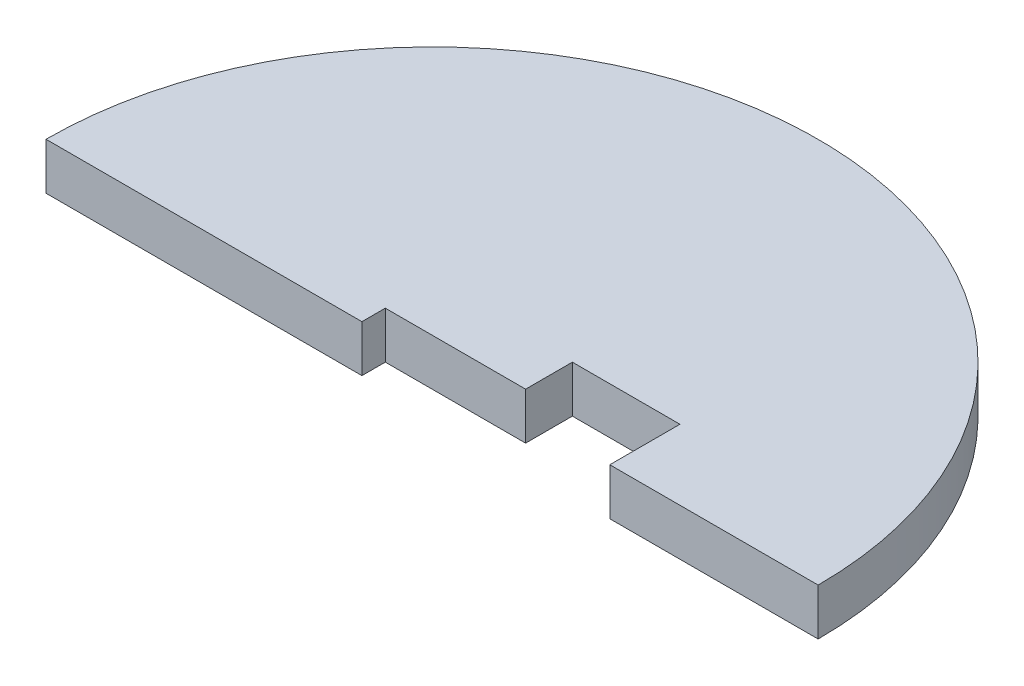
ISO-10303-21;
HEADER;
FILE_DESCRIPTION(('STEP AP214'),'2;1');
FILE_NAME('part.step','',(''),(''),'','','');
FILE_SCHEMA(('AUTOMOTIVE_DESIGN { 1 0 10303 214 1 1 1 1 }'));
ENDSEC;
DATA;
#1=APPLICATION_CONTEXT('core data for automotive mechanical design processes');
#2=APPLICATION_PROTOCOL_DEFINITION('international standard','automotive_design',2000,#1);
#3=PRODUCT_CONTEXT('',#1,'mechanical');
#4=PRODUCT('Part','Part','',(#3));
#5=PRODUCT_RELATED_PRODUCT_CATEGORY('part','',(#4));
#6=PRODUCT_DEFINITION_FORMATION('','',#4);
#7=PRODUCT_DEFINITION_CONTEXT('part definition',#1,'design');
#8=PRODUCT_DEFINITION('design','',#6,#7);
#9=PRODUCT_DEFINITION_SHAPE('','',#8);
#10=(LENGTH_UNIT() NAMED_UNIT(*) SI_UNIT(.MILLI.,.METRE.));
#11=(NAMED_UNIT(*) PLANE_ANGLE_UNIT() SI_UNIT($,.RADIAN.));
#12=(NAMED_UNIT(*) SI_UNIT($,.STERADIAN.) SOLID_ANGLE_UNIT());
#13=UNCERTAINTY_MEASURE_WITH_UNIT(LENGTH_MEASURE(1.E-05),#10,'distance_accuracy_value','');
#14=(GEOMETRIC_REPRESENTATION_CONTEXT(3) GLOBAL_UNCERTAINTY_ASSIGNED_CONTEXT((#13)) GLOBAL_UNIT_ASSIGNED_CONTEXT((#10,
#11,#12)) REPRESENTATION_CONTEXT('',''));
#15=CARTESIAN_POINT('',(0.,0.,0.));
#16=DIRECTION('',(0.,0.,1.));
#17=DIRECTION('',(1.,0.,0.));
#18=AXIS2_PLACEMENT_3D('',#15,#16,#17);
#19=CARTESIAN_POINT('',(0.,0.,0.));
#20=DIRECTION('',(0.,0.,1.));
#21=DIRECTION('',(1.,0.,0.));
#22=AXIS2_PLACEMENT_3D('',#19,#20,#21);
#23=PLANE('',#22);
#24=DIRECTION('',(0.,1.,0.));
#25=VECTOR('',#24,1.);
#26=CARTESIAN_POINT('',(38.,0.,0.));
#27=LINE('',#26,#25);
#28=CARTESIAN_POINT('',(38.,0.,0.));
#29=VERTEX_POINT('',#28);
#30=CARTESIAN_POINT('',(38.,10.,0.));
#31=VERTEX_POINT('',#30);
#32=EDGE_CURVE('E133',#29,#31,#27,.T.);
#33=ORIENTED_EDGE('',*,*,#32,.F.);
#34=DIRECTION('',(1.,0.,0.));
#35=VECTOR('',#34,1.);
#36=CARTESIAN_POINT('',(0.,0.,0.));
#37=LINE('',#36,#35);
#38=CARTESIAN_POINT('',(82.55,0.,0.));
#39=VERTEX_POINT('',#38);
#40=EDGE_CURVE('E123',#29,#39,#37,.T.);
#41=ORIENTED_EDGE('',*,*,#40,.T.);
#42=DIRECTION('',(0.,1.,0.));
#43=VECTOR('',#42,1.);
#44=CARTESIAN_POINT('',(82.55,0.,0.));
#45=LINE('',#44,#43);
#46=CARTESIAN_POINT('',(82.55,10.,0.));
#47=VERTEX_POINT('',#46);
#48=EDGE_CURVE('E157',#39,#47,#45,.T.);
#49=ORIENTED_EDGE('',*,*,#48,.T.);
#50=DIRECTION('',(1.,0.,0.));
#51=VECTOR('',#50,1.);
#52=CARTESIAN_POINT('',(0.,10.,0.));
#53=LINE('',#52,#51);
#54=EDGE_CURVE('E150',#31,#47,#53,.T.);
#55=ORIENTED_EDGE('',*,*,#54,.F.);
#56=EDGE_LOOP('',(#33,#41,#49,#55));
#57=FACE_BOUND('',#56,.T.);
#58=ADVANCED_FACE('F34',(#57),#23,.T.);
#59=CARTESIAN_POINT('',(0.,10.,0.));
#60=DIRECTION('',(0.,-1.,0.));
#61=DIRECTION('',(0.,0.,-1.));
#62=AXIS2_PLACEMENT_3D('',#59,#60,#61);
#63=CYLINDRICAL_SURFACE('',#62,82.55);
#64=DIRECTION('',(0.,1.,0.));
#65=VECTOR('',#64,1.);
#66=CARTESIAN_POINT('',(-82.55,0.,0.));
#67=LINE('',#66,#65);
#68=CARTESIAN_POINT('',(-82.55,0.,0.));
#69=VERTEX_POINT('',#68);
#70=CARTESIAN_POINT('',(-82.55,10.,0.));
#71=VERTEX_POINT('',#70);
#72=EDGE_CURVE('E56',#69,#71,#67,.T.);
#73=ORIENTED_EDGE('',*,*,#72,.T.);
#74=CARTESIAN_POINT('',(0.,10.,0.));
#75=DIRECTION('',(0.,1.,0.));
#76=DIRECTION('',(0.,0.,1.));
#77=AXIS2_PLACEMENT_3D('',#74,#75,#76);
#78=CIRCLE('',#77,82.55);
#79=EDGE_CURVE('E42',#47,#71,#78,.T.);
#80=ORIENTED_EDGE('',*,*,#79,.F.);
#81=ORIENTED_EDGE('',*,*,#48,.F.);
#82=CARTESIAN_POINT('',(0.,0.,0.));
#83=DIRECTION('',(0.,1.,0.));
#84=DIRECTION('',(0.,0.,1.));
#85=AXIS2_PLACEMENT_3D('',#82,#83,#84);
#86=CIRCLE('',#85,82.55);
#87=EDGE_CURVE('E160',#39,#69,#86,.T.);
#88=ORIENTED_EDGE('',*,*,#87,.T.);
#89=EDGE_LOOP('',(#73,#80,#81,#88));
#90=FACE_BOUND('',#89,.T.);
#91=ADVANCED_FACE('F36',(#90),#63,.T.);
#92=CARTESIAN_POINT('',(0.,10.,0.));
#93=DIRECTION('',(0.,1.,0.));
#94=DIRECTION('',(0.,0.,1.));
#95=AXIS2_PLACEMENT_3D('',#92,#93,#94);
#96=PLANE('',#95);
#97=DIRECTION('',(0.,0.,1.));
#98=VECTOR('',#97,1.);
#99=CARTESIAN_POINT('',(15.,10.,-15.));
#100=LINE('',#99,#98);
#101=CARTESIAN_POINT('',(15.,10.,-15.));
#102=VERTEX_POINT('',#101);
#103=CARTESIAN_POINT('',(15.,10.,-5.));
#104=VERTEX_POINT('',#103);
#105=EDGE_CURVE('E129',#102,#104,#100,.T.);
#106=ORIENTED_EDGE('',*,*,#105,.F.);
#107=DIRECTION('',(-1.,0.,0.));
#108=VECTOR('',#107,1.);
#109=CARTESIAN_POINT('',(15.,10.,-15.));
#110=LINE('',#109,#108);
#111=CARTESIAN_POINT('',(38.,10.,-15.));
#112=VERTEX_POINT('',#111);
#113=EDGE_CURVE('E126',#112,#102,#110,.T.);
#114=ORIENTED_EDGE('',*,*,#113,.F.);
#115=DIRECTION('',(0.,0.,-1.));
#116=VECTOR('',#115,1.);
#117=CARTESIAN_POINT('',(38.,10.,-15.));
#118=LINE('',#117,#116);
#119=EDGE_CURVE('E107',#31,#112,#118,.T.);
#120=ORIENTED_EDGE('',*,*,#119,.F.);
#121=ORIENTED_EDGE('',*,*,#54,.T.);
#122=ORIENTED_EDGE('',*,*,#79,.T.);
#123=CARTESIAN_POINT('',(-15.,10.,0.));
#124=VERTEX_POINT('',#123);
#125=EDGE_CURVE('E154',#71,#124,#53,.T.);
#126=ORIENTED_EDGE('',*,*,#125,.T.);
#127=DIRECTION('',(0.,0.,1.));
#128=VECTOR('',#127,1.);
#129=CARTESIAN_POINT('',(-15.,10.,0.));
#130=LINE('',#129,#128);
#131=CARTESIAN_POINT('',(-15.,10.,-5.));
#132=VERTEX_POINT('',#131);
#133=EDGE_CURVE('E48',#132,#124,#130,.T.);
#134=ORIENTED_EDGE('',*,*,#133,.F.);
#135=DIRECTION('',(-1.,0.,0.));
#136=VECTOR('',#135,1.);
#137=CARTESIAN_POINT('',(0.,10.,-5.));
#138=LINE('',#137,#136);
#139=EDGE_CURVE('E148',#104,#132,#138,.T.);
#140=ORIENTED_EDGE('',*,*,#139,.F.);
#141=EDGE_LOOP('',(#106,#114,#120,#121,#122,#126,#134,#140));
#142=FACE_BOUND('',#141,.T.);
#143=ADVANCED_FACE('F168',(#142),#96,.T.);
#144=CARTESIAN_POINT('',(0.,0.,0.));
#145=DIRECTION('',(0.,1.,0.));
#146=DIRECTION('',(0.,0.,1.));
#147=AXIS2_PLACEMENT_3D('',#144,#145,#146);
#148=PLANE('',#147);
#149=DIRECTION('',(-1.,0.,0.));
#150=VECTOR('',#149,1.);
#151=CARTESIAN_POINT('',(15.,0.,-15.));
#152=LINE('',#151,#150);
#153=CARTESIAN_POINT('',(38.,0.,-15.));
#154=VERTEX_POINT('',#153);
#155=CARTESIAN_POINT('',(15.,0.,-15.));
#156=VERTEX_POINT('',#155);
#157=EDGE_CURVE('E112',#154,#156,#152,.T.);
#158=ORIENTED_EDGE('',*,*,#157,.T.);
#159=DIRECTION('',(0.,0.,1.));
#160=VECTOR('',#159,1.);
#161=CARTESIAN_POINT('',(15.,0.,-15.));
#162=LINE('',#161,#160);
#163=CARTESIAN_POINT('',(15.,0.,-5.));
#164=VERTEX_POINT('',#163);
#165=EDGE_CURVE('E124',#156,#164,#162,.T.);
#166=ORIENTED_EDGE('',*,*,#165,.T.);
#167=DIRECTION('',(-1.,0.,0.));
#168=VECTOR('',#167,1.);
#169=CARTESIAN_POINT('',(-15.,0.,-5.));
#170=LINE('',#169,#168);
#171=CARTESIAN_POINT('',(-15.,0.,-5.));
#172=VERTEX_POINT('',#171);
#173=EDGE_CURVE('E136',#164,#172,#170,.T.);
#174=ORIENTED_EDGE('',*,*,#173,.T.);
#175=DIRECTION('',(0.,0.,1.));
#176=VECTOR('',#175,1.);
#177=CARTESIAN_POINT('',(-15.,0.,-5.));
#178=LINE('',#177,#176);
#179=CARTESIAN_POINT('',(-15.,0.,0.));
#180=VERTEX_POINT('',#179);
#181=EDGE_CURVE('E139',#172,#180,#178,.T.);
#182=ORIENTED_EDGE('',*,*,#181,.T.);
#183=EDGE_CURVE('E151',#69,#180,#37,.T.);
#184=ORIENTED_EDGE('',*,*,#183,.F.);
#185=ORIENTED_EDGE('',*,*,#87,.F.);
#186=ORIENTED_EDGE('',*,*,#40,.F.);
#187=DIRECTION('',(0.,0.,-1.));
#188=VECTOR('',#187,1.);
#189=CARTESIAN_POINT('',(38.,0.,-15.));
#190=LINE('',#189,#188);
#191=EDGE_CURVE('E104',#29,#154,#190,.T.);
#192=ORIENTED_EDGE('',*,*,#191,.T.);
#193=EDGE_LOOP('',(#158,#166,#174,#182,#184,#185,#186,#192));
#194=FACE_BOUND('',#193,.T.);
#195=ADVANCED_FACE('F121',(#194),#148,.F.);
#196=DIRECTION('',(0.,-1.,0.));
#197=VECTOR('',#196,1.);
#198=CARTESIAN_POINT('',(-15.,0.,0.));
#199=LINE('',#198,#197);
#200=EDGE_CURVE('E11',#124,#180,#199,.T.);
#201=ORIENTED_EDGE('',*,*,#200,.F.);
#202=ORIENTED_EDGE('',*,*,#125,.F.);
#203=ORIENTED_EDGE('',*,*,#72,.F.);
#204=ORIENTED_EDGE('',*,*,#183,.T.);
#205=EDGE_LOOP('',(#201,#202,#203,#204));
#206=FACE_BOUND('',#205,.T.);
#207=ADVANCED_FACE('F165',(#206),#23,.T.);
#208=CARTESIAN_POINT('',(-15.,0.,-5.));
#209=DIRECTION('',(-1.,0.,0.));
#210=DIRECTION('',(0.,0.,1.));
#211=AXIS2_PLACEMENT_3D('',#208,#209,#210);
#212=PLANE('',#211);
#213=ORIENTED_EDGE('',*,*,#133,.T.);
#214=ORIENTED_EDGE('',*,*,#200,.T.);
#215=ORIENTED_EDGE('',*,*,#181,.F.);
#216=DIRECTION('',(0.,1.,0.));
#217=VECTOR('',#216,1.);
#218=CARTESIAN_POINT('',(-15.,0.,-5.));
#219=LINE('',#218,#217);
#220=EDGE_CURVE('E143',#172,#132,#219,.T.);
#221=ORIENTED_EDGE('',*,*,#220,.T.);
#222=EDGE_LOOP('',(#213,#214,#215,#221));
#223=FACE_BOUND('',#222,.T.);
#224=ADVANCED_FACE('F178',(#223),#212,.F.);
#225=CARTESIAN_POINT('',(-15.,0.,-5.));
#226=DIRECTION('',(0.,0.,-1.));
#227=DIRECTION('',(-1.,0.,0.));
#228=AXIS2_PLACEMENT_3D('',#225,#226,#227);
#229=PLANE('',#228);
#230=ORIENTED_EDGE('',*,*,#139,.T.);
#231=ORIENTED_EDGE('',*,*,#220,.F.);
#232=ORIENTED_EDGE('',*,*,#173,.F.);
#233=DIRECTION('',(0.,1.,0.));
#234=VECTOR('',#233,1.);
#235=CARTESIAN_POINT('',(15.,0.,-5.));
#236=LINE('',#235,#234);
#237=EDGE_CURVE('E142',#164,#104,#236,.T.);
#238=ORIENTED_EDGE('',*,*,#237,.T.);
#239=EDGE_LOOP('',(#230,#231,#232,#238));
#240=FACE_BOUND('',#239,.T.);
#241=ADVANCED_FACE('F176',(#240),#229,.F.);
#242=CARTESIAN_POINT('',(15.,0.,-15.));
#243=DIRECTION('',(-1.,0.,0.));
#244=DIRECTION('',(0.,0.,1.));
#245=AXIS2_PLACEMENT_3D('',#242,#243,#244);
#246=PLANE('',#245);
#247=ORIENTED_EDGE('',*,*,#165,.F.);
#248=DIRECTION('',(0.,1.,0.));
#249=VECTOR('',#248,1.);
#250=CARTESIAN_POINT('',(15.,0.,-15.));
#251=LINE('',#250,#249);
#252=EDGE_CURVE('E111',#156,#102,#251,.T.);
#253=ORIENTED_EDGE('',*,*,#252,.T.);
#254=ORIENTED_EDGE('',*,*,#105,.T.);
#255=ORIENTED_EDGE('',*,*,#237,.F.);
#256=EDGE_LOOP('',(#247,#253,#254,#255));
#257=FACE_BOUND('',#256,.T.);
#258=ADVANCED_FACE('F173',(#257),#246,.F.);
#259=CARTESIAN_POINT('',(15.,0.,-15.));
#260=DIRECTION('',(0.,0.,-1.));
#261=DIRECTION('',(-1.,0.,0.));
#262=AXIS2_PLACEMENT_3D('',#259,#260,#261);
#263=PLANE('',#262);
#264=ORIENTED_EDGE('',*,*,#113,.T.);
#265=ORIENTED_EDGE('',*,*,#252,.F.);
#266=ORIENTED_EDGE('',*,*,#157,.F.);
#267=DIRECTION('',(0.,1.,0.));
#268=VECTOR('',#267,1.);
#269=CARTESIAN_POINT('',(38.,0.,-15.));
#270=LINE('',#269,#268);
#271=EDGE_CURVE('E100',#154,#112,#270,.T.);
#272=ORIENTED_EDGE('',*,*,#271,.T.);
#273=EDGE_LOOP('',(#264,#265,#266,#272));
#274=FACE_BOUND('',#273,.T.);
#275=ADVANCED_FACE('F115',(#274),#263,.F.);
#276=CARTESIAN_POINT('',(38.,0.,-15.));
#277=DIRECTION('',(1.,0.,0.));
#278=DIRECTION('',(0.,0.,-1.));
#279=AXIS2_PLACEMENT_3D('',#276,#277,#278);
#280=PLANE('',#279);
#281=ORIENTED_EDGE('',*,*,#32,.T.);
#282=ORIENTED_EDGE('',*,*,#119,.T.);
#283=ORIENTED_EDGE('',*,*,#271,.F.);
#284=ORIENTED_EDGE('',*,*,#191,.F.);
#285=EDGE_LOOP('',(#281,#282,#283,#284));
#286=FACE_BOUND('',#285,.T.);
#287=ADVANCED_FACE('F102',(#286),#280,.F.);
#288=CLOSED_SHELL('',(#58,#91,#143,#195,#207,#224,#241,#258,#275,#287));
#289=MANIFOLD_SOLID_BREP('B2',#288);
#290=ADVANCED_BREP_SHAPE_REPRESENTATION('',(#18,#289),#14);
#291=SHAPE_DEFINITION_REPRESENTATION(#9,#290);
ENDSEC;
END-ISO-10303-21;
